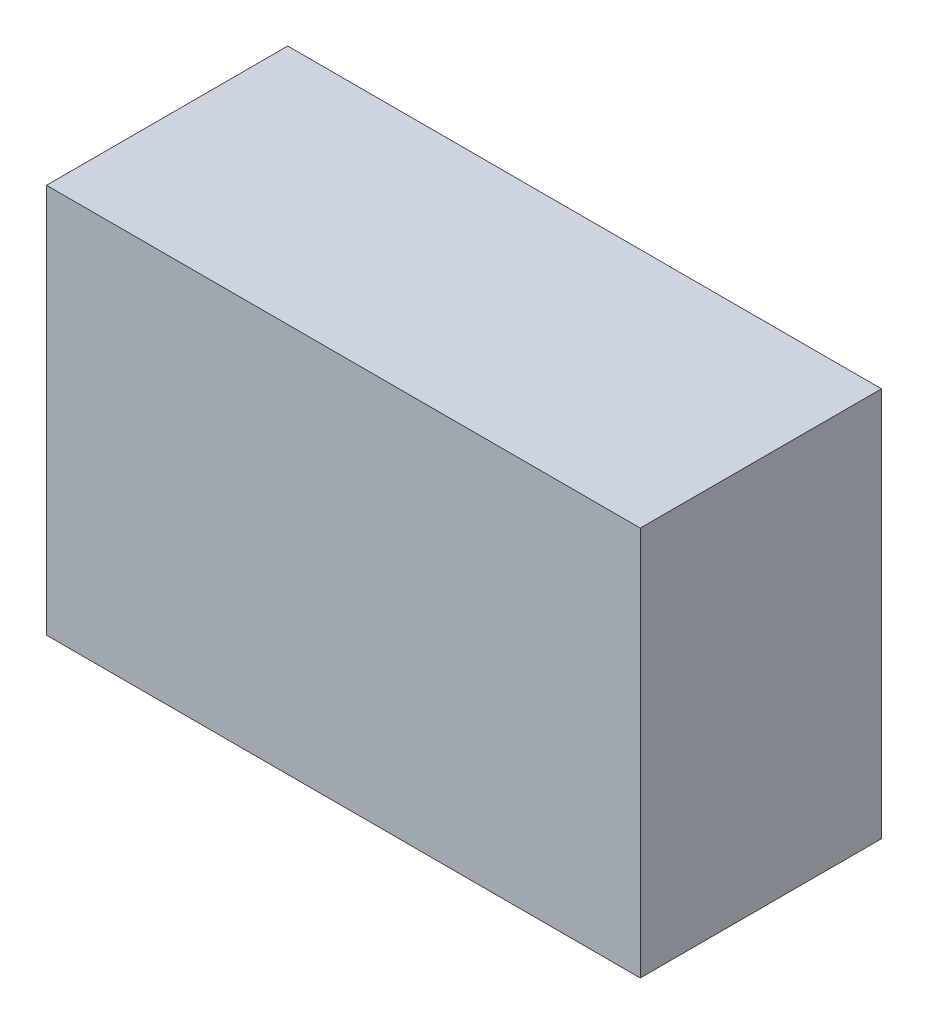
ISO-10303-21;
HEADER;
FILE_DESCRIPTION(('STEP AP214'),'2;1');
FILE_NAME('part.step','',(''),(''),'','','');
FILE_SCHEMA(('AUTOMOTIVE_DESIGN { 1 0 10303 214 1 1 1 1 }'));
ENDSEC;
DATA;
#1=APPLICATION_CONTEXT('core data for automotive mechanical design processes');
#2=APPLICATION_PROTOCOL_DEFINITION('international standard','automotive_design',2000,#1);
#3=PRODUCT_CONTEXT('',#1,'mechanical');
#4=PRODUCT('Part','Part','',(#3));
#5=PRODUCT_RELATED_PRODUCT_CATEGORY('part','',(#4));
#6=PRODUCT_DEFINITION_FORMATION('','',#4);
#7=PRODUCT_DEFINITION_CONTEXT('part definition',#1,'design');
#8=PRODUCT_DEFINITION('design','',#6,#7);
#9=PRODUCT_DEFINITION_SHAPE('','',#8);
#10=(LENGTH_UNIT() NAMED_UNIT(*) SI_UNIT(.MILLI.,.METRE.));
#11=(NAMED_UNIT(*) PLANE_ANGLE_UNIT() SI_UNIT($,.RADIAN.));
#12=(NAMED_UNIT(*) SI_UNIT($,.STERADIAN.) SOLID_ANGLE_UNIT());
#13=UNCERTAINTY_MEASURE_WITH_UNIT(LENGTH_MEASURE(1.E-05),#10,'distance_accuracy_value','');
#14=(GEOMETRIC_REPRESENTATION_CONTEXT(3) GLOBAL_UNCERTAINTY_ASSIGNED_CONTEXT((#13)) GLOBAL_UNIT_ASSIGNED_CONTEXT((#10,
#11,#12)) REPRESENTATION_CONTEXT('',''));
#15=CARTESIAN_POINT('',(0.,0.,0.));
#16=DIRECTION('',(0.,0.,1.));
#17=DIRECTION('',(1.,0.,0.));
#18=AXIS2_PLACEMENT_3D('',#15,#16,#17);
#19=CARTESIAN_POINT('',(-0.7999984,-0.52500022,0.65000124));
#20=DIRECTION('',(0.,0.,-1.));
#21=DIRECTION('',(-1.,0.,0.));
#22=AXIS2_PLACEMENT_3D('',#19,#20,#21);
#23=PLANE('',#22);
#24=DIRECTION('',(0.,1.,0.));
#25=VECTOR('',#24,1.);
#26=CARTESIAN_POINT('',(0.80000094,-0.52500022,0.65000124));
#27=LINE('',#26,#25);
#28=CARTESIAN_POINT('',(0.80000094,-0.52500022,0.65000124));
#29=VERTEX_POINT('',#28);
#30=CARTESIAN_POINT('',(0.80000094,0.52500022,0.65000124));
#31=VERTEX_POINT('',#30);
#32=EDGE_CURVE('E54',#29,#31,#27,.T.);
#33=ORIENTED_EDGE('',*,*,#32,.T.);
#34=DIRECTION('',(1.,0.,0.));
#35=VECTOR('',#34,1.);
#36=CARTESIAN_POINT('',(0.80000094,0.52500022,0.65000124));
#37=LINE('',#36,#35);
#38=CARTESIAN_POINT('',(-0.7999984,0.52500022,0.65000124));
#39=VERTEX_POINT('',#38);
#40=EDGE_CURVE('E56',#31,#39,#37,.F.);
#41=ORIENTED_EDGE('',*,*,#40,.T.);
#42=DIRECTION('',(0.,1.,0.));
#43=VECTOR('',#42,1.);
#44=CARTESIAN_POINT('',(-0.7999984,0.52500022,0.65000124));
#45=LINE('',#44,#43);
#46=CARTESIAN_POINT('',(-0.7999984,-0.52500022,0.65000124));
#47=VERTEX_POINT('',#46);
#48=EDGE_CURVE('E19',#39,#47,#45,.F.);
#49=ORIENTED_EDGE('',*,*,#48,.T.);
#50=DIRECTION('',(1.,0.,0.));
#51=VECTOR('',#50,1.);
#52=CARTESIAN_POINT('',(-0.7999984,-0.52500022,0.65000124));
#53=LINE('',#52,#51);
#54=EDGE_CURVE('E79',#47,#29,#53,.T.);
#55=ORIENTED_EDGE('',*,*,#54,.T.);
#56=EDGE_LOOP('',(#33,#41,#49,#55));
#57=FACE_BOUND('',#56,.T.);
#58=ADVANCED_FACE('F16',(#57),#23,.F.);
#59=CARTESIAN_POINT('',(-0.7999984,0.52500022,0.));
#60=DIRECTION('',(1.,0.,0.));
#61=DIRECTION('',(0.,0.,-1.));
#62=AXIS2_PLACEMENT_3D('',#59,#60,#61);
#63=PLANE('',#62);
#64=DIRECTION('',(0.,0.,1.));
#65=VECTOR('',#64,1.);
#66=CARTESIAN_POINT('',(-0.7999984,-0.52500022,0.));
#67=LINE('',#66,#65);
#68=CARTESIAN_POINT('',(-0.7999984,-0.52500022,0.));
#69=VERTEX_POINT('',#68);
#70=EDGE_CURVE('E67',#69,#47,#67,.T.);
#71=ORIENTED_EDGE('',*,*,#70,.T.);
#72=ORIENTED_EDGE('',*,*,#48,.F.);
#73=DIRECTION('',(0.,0.,-1.));
#74=VECTOR('',#73,1.);
#75=CARTESIAN_POINT('',(-0.7999984,0.52500022,0.));
#76=LINE('',#75,#74);
#77=CARTESIAN_POINT('',(-0.7999984,0.52500022,0.));
#78=VERTEX_POINT('',#77);
#79=EDGE_CURVE('E62',#39,#78,#76,.T.);
#80=ORIENTED_EDGE('',*,*,#79,.T.);
#81=DIRECTION('',(0.,1.,0.));
#82=VECTOR('',#81,1.);
#83=CARTESIAN_POINT('',(-0.7999984,-0.52500022,0.));
#84=LINE('',#83,#82);
#85=EDGE_CURVE('E82',#69,#78,#84,.T.);
#86=ORIENTED_EDGE('',*,*,#85,.F.);
#87=EDGE_LOOP('',(#71,#72,#80,#86));
#88=FACE_BOUND('',#87,.T.);
#89=ADVANCED_FACE('F64',(#88),#63,.F.);
#90=CARTESIAN_POINT('',(0.80000094,0.52500022,0.));
#91=DIRECTION('',(0.,-1.,0.));
#92=DIRECTION('',(0.,0.,-1.));
#93=AXIS2_PLACEMENT_3D('',#90,#91,#92);
#94=PLANE('',#93);
#95=ORIENTED_EDGE('',*,*,#79,.F.);
#96=ORIENTED_EDGE('',*,*,#40,.F.);
#97=DIRECTION('',(0.,0.,1.));
#98=VECTOR('',#97,1.);
#99=CARTESIAN_POINT('',(0.80000094,0.52500022,0.));
#100=LINE('',#99,#98);
#101=CARTESIAN_POINT('',(0.80000094,0.52500022,0.));
#102=VERTEX_POINT('',#101);
#103=EDGE_CURVE('E74',#31,#102,#100,.F.);
#104=ORIENTED_EDGE('',*,*,#103,.T.);
#105=DIRECTION('',(-1.,0.,0.));
#106=VECTOR('',#105,1.);
#107=CARTESIAN_POINT('',(-0.7999984,0.52500022,0.));
#108=LINE('',#107,#106);
#109=EDGE_CURVE('E71',#78,#102,#108,.F.);
#110=ORIENTED_EDGE('',*,*,#109,.F.);
#111=EDGE_LOOP('',(#95,#96,#104,#110));
#112=FACE_BOUND('',#111,.T.);
#113=ADVANCED_FACE('F69',(#112),#94,.F.);
#114=CARTESIAN_POINT('',(0.80000094,-0.52500022,0.));
#115=DIRECTION('',(-1.,0.,0.));
#116=DIRECTION('',(0.,0.,1.));
#117=AXIS2_PLACEMENT_3D('',#114,#115,#116);
#118=PLANE('',#117);
#119=ORIENTED_EDGE('',*,*,#103,.F.);
#120=ORIENTED_EDGE('',*,*,#32,.F.);
#121=DIRECTION('',(0.,0.,1.));
#122=VECTOR('',#121,1.);
#123=CARTESIAN_POINT('',(0.80000094,-0.52500022,0.));
#124=LINE('',#123,#122);
#125=CARTESIAN_POINT('',(0.80000094,-0.52500022,0.));
#126=VERTEX_POINT('',#125);
#127=EDGE_CURVE('E34',#29,#126,#124,.F.);
#128=ORIENTED_EDGE('',*,*,#127,.T.);
#129=DIRECTION('',(0.,1.,0.));
#130=VECTOR('',#129,1.);
#131=CARTESIAN_POINT('',(0.80000094,-0.52500022,0.));
#132=LINE('',#131,#130);
#133=EDGE_CURVE('E25',#102,#126,#132,.F.);
#134=ORIENTED_EDGE('',*,*,#133,.F.);
#135=EDGE_LOOP('',(#119,#120,#128,#134));
#136=FACE_BOUND('',#135,.T.);
#137=ADVANCED_FACE('F88',(#136),#118,.F.);
#138=CARTESIAN_POINT('',(-0.7999984,-0.52500022,0.));
#139=DIRECTION('',(0.,1.,0.));
#140=DIRECTION('',(0.,0.,1.));
#141=AXIS2_PLACEMENT_3D('',#138,#139,#140);
#142=PLANE('',#141);
#143=ORIENTED_EDGE('',*,*,#127,.F.);
#144=ORIENTED_EDGE('',*,*,#54,.F.);
#145=ORIENTED_EDGE('',*,*,#70,.F.);
#146=DIRECTION('',(-1.,0.,0.));
#147=VECTOR('',#146,1.);
#148=CARTESIAN_POINT('',(-0.7999984,-0.52500022,0.));
#149=LINE('',#148,#147);
#150=EDGE_CURVE('E11',#126,#69,#149,.T.);
#151=ORIENTED_EDGE('',*,*,#150,.F.);
#152=EDGE_LOOP('',(#143,#144,#145,#151));
#153=FACE_BOUND('',#152,.T.);
#154=ADVANCED_FACE('F90',(#153),#142,.F.);
#155=CARTESIAN_POINT('',(-0.7999984,-0.52500022,0.));
#156=DIRECTION('',(0.,0.,-1.));
#157=DIRECTION('',(-1.,0.,0.));
#158=AXIS2_PLACEMENT_3D('',#155,#156,#157);
#159=PLANE('',#158);
#160=ORIENTED_EDGE('',*,*,#133,.T.);
#161=ORIENTED_EDGE('',*,*,#150,.T.);
#162=ORIENTED_EDGE('',*,*,#85,.T.);
#163=ORIENTED_EDGE('',*,*,#109,.T.);
#164=EDGE_LOOP('',(#160,#161,#162,#163));
#165=FACE_BOUND('',#164,.T.);
#166=ADVANCED_FACE('F87',(#165),#159,.T.);
#167=CLOSED_SHELL('',(#58,#89,#113,#137,#154,#166));
#168=MANIFOLD_SOLID_BREP('B1',#167);
#169=ADVANCED_BREP_SHAPE_REPRESENTATION('',(#18,#168),#14);
#170=SHAPE_DEFINITION_REPRESENTATION(#9,#169);
ENDSEC;
END-ISO-10303-21;
